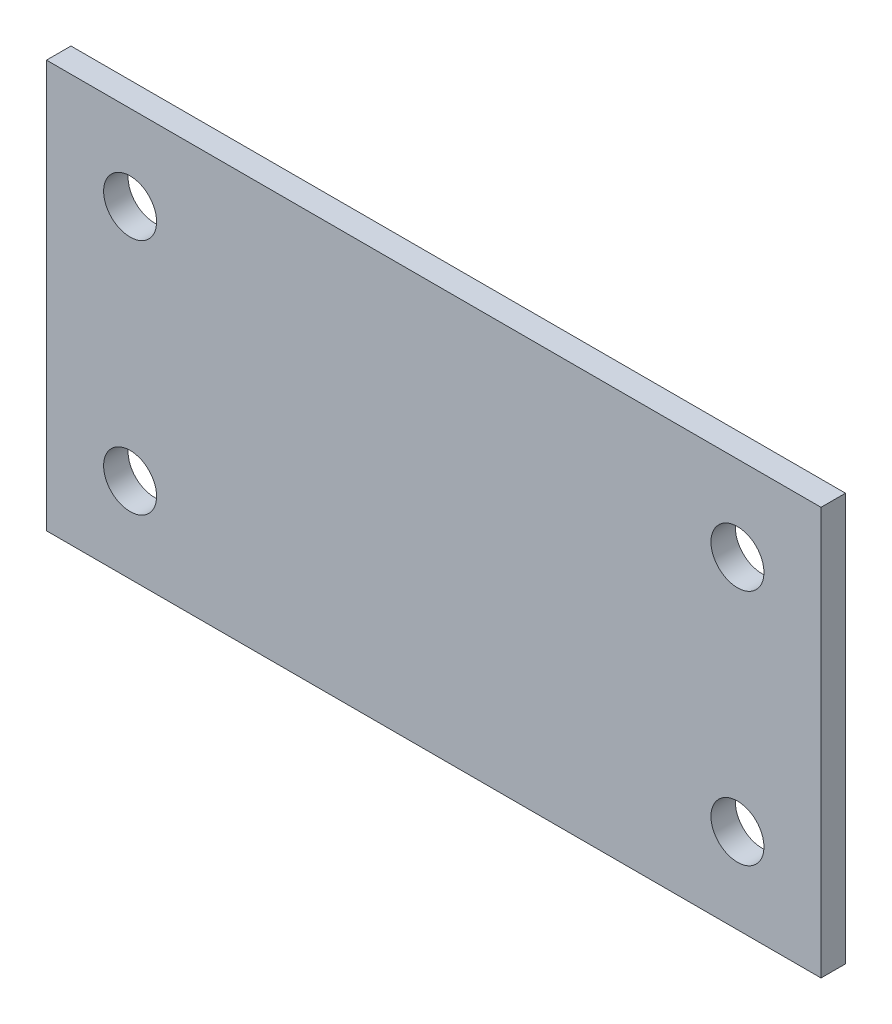
ISO-10303-21;
HEADER;
FILE_DESCRIPTION(('STEP AP214'),'2;1');
FILE_NAME('part.step','',(''),(''),'','','');
FILE_SCHEMA(('AUTOMOTIVE_DESIGN { 1 0 10303 214 1 1 1 1 }'));
ENDSEC;
DATA;
#1=APPLICATION_CONTEXT('core data for automotive mechanical design processes');
#2=APPLICATION_PROTOCOL_DEFINITION('international standard','automotive_design',2000,#1);
#3=PRODUCT_CONTEXT('',#1,'mechanical');
#4=PRODUCT('Part','Part','',(#3));
#5=PRODUCT_RELATED_PRODUCT_CATEGORY('part','',(#4));
#6=PRODUCT_DEFINITION_FORMATION('','',#4);
#7=PRODUCT_DEFINITION_CONTEXT('part definition',#1,'design');
#8=PRODUCT_DEFINITION('design','',#6,#7);
#9=PRODUCT_DEFINITION_SHAPE('','',#8);
#10=(LENGTH_UNIT() NAMED_UNIT(*) SI_UNIT(.MILLI.,.METRE.));
#11=(NAMED_UNIT(*) PLANE_ANGLE_UNIT() SI_UNIT($,.RADIAN.));
#12=(NAMED_UNIT(*) SI_UNIT($,.STERADIAN.) SOLID_ANGLE_UNIT());
#13=UNCERTAINTY_MEASURE_WITH_UNIT(LENGTH_MEASURE(1.E-05),#10,'distance_accuracy_value','');
#14=(GEOMETRIC_REPRESENTATION_CONTEXT(3) GLOBAL_UNCERTAINTY_ASSIGNED_CONTEXT((#13)) GLOBAL_UNIT_ASSIGNED_CONTEXT((#10,
#11,#12)) REPRESENTATION_CONTEXT('',''));
#15=CARTESIAN_POINT('',(0.,0.,0.));
#16=DIRECTION('',(0.,0.,1.));
#17=DIRECTION('',(1.,0.,0.));
#18=AXIS2_PLACEMENT_3D('',#15,#16,#17);
#19=CARTESIAN_POINT('',(0.,0.,12.));
#20=DIRECTION('',(0.,0.,-1.));
#21=DIRECTION('',(-1.,0.,0.));
#22=AXIS2_PLACEMENT_3D('',#19,#20,#21);
#23=PLANE('',#22);
#24=CARTESIAN_POINT('',(338.995198873229,158.313212162657,12.));
#25=DIRECTION('',(0.,0.,1.));
#26=DIRECTION('',(-1.,0.,0.));
#27=AXIS2_PLACEMENT_3D('',#24,#25,#26);
#28=CIRCLE('',#27,13.);
#29=CARTESIAN_POINT('',(325.995198873229,158.313212162657,12.));
#30=VERTEX_POINT('',#29);
#31=EDGE_CURVE('E131',#30,#30,#28,.T.);
#32=ORIENTED_EDGE('',*,*,#31,.F.);
#33=EDGE_LOOP('',(#32));
#34=FACE_BOUND('',#33,.T.);
#35=CARTESIAN_POINT('',(41.0048011267713,158.313212162657,12.));
#36=DIRECTION('',(0.,0.,-1.));
#37=DIRECTION('',(1.,0.,0.));
#38=AXIS2_PLACEMENT_3D('',#35,#36,#37);
#39=CIRCLE('',#38,13.);
#40=CARTESIAN_POINT('',(54.0048011267713,158.313212162657,12.));
#41=VERTEX_POINT('',#40);
#42=EDGE_CURVE('E119',#41,#41,#39,.T.);
#43=ORIENTED_EDGE('',*,*,#42,.T.);
#44=EDGE_LOOP('',(#43));
#45=FACE_BOUND('',#44,.T.);
#46=CARTESIAN_POINT('',(41.0048011267713,41.6867878373433,12.));
#47=DIRECTION('',(0.,0.,1.));
#48=DIRECTION('',(1.,0.,0.));
#49=AXIS2_PLACEMENT_3D('',#46,#47,#48);
#50=CIRCLE('',#49,13.);
#51=CARTESIAN_POINT('',(54.0048011267713,41.6867878373433,12.));
#52=VERTEX_POINT('',#51);
#53=EDGE_CURVE('E113',#52,#52,#50,.T.);
#54=ORIENTED_EDGE('',*,*,#53,.F.);
#55=EDGE_LOOP('',(#54));
#56=FACE_BOUND('',#55,.T.);
#57=DIRECTION('',(0.,-1.,0.));
#58=VECTOR('',#57,1.);
#59=CARTESIAN_POINT('',(0.,0.,12.));
#60=LINE('',#59,#58);
#61=CARTESIAN_POINT('',(0.,200.,12.));
#62=VERTEX_POINT('',#61);
#63=CARTESIAN_POINT('',(0.,0.,12.));
#64=VERTEX_POINT('',#63);
#65=EDGE_CURVE('E86',#62,#64,#60,.T.);
#66=ORIENTED_EDGE('',*,*,#65,.T.);
#67=DIRECTION('',(1.,0.,0.));
#68=VECTOR('',#67,1.);
#69=CARTESIAN_POINT('',(0.,0.,12.));
#70=LINE('',#69,#68);
#71=CARTESIAN_POINT('',(380.,0.,12.));
#72=VERTEX_POINT('',#71);
#73=EDGE_CURVE('E81',#64,#72,#70,.T.);
#74=ORIENTED_EDGE('',*,*,#73,.T.);
#75=DIRECTION('',(0.,1.,0.));
#76=VECTOR('',#75,1.);
#77=CARTESIAN_POINT('',(380.,0.,12.));
#78=LINE('',#77,#76);
#79=CARTESIAN_POINT('',(380.,200.,12.));
#80=VERTEX_POINT('',#79);
#81=EDGE_CURVE('E84',#72,#80,#78,.T.);
#82=ORIENTED_EDGE('',*,*,#81,.T.);
#83=DIRECTION('',(-1.,0.,0.));
#84=VECTOR('',#83,1.);
#85=CARTESIAN_POINT('',(0.,200.,12.));
#86=LINE('',#85,#84);
#87=EDGE_CURVE('E51',#80,#62,#86,.T.);
#88=ORIENTED_EDGE('',*,*,#87,.T.);
#89=EDGE_LOOP('',(#66,#74,#82,#88));
#90=FACE_BOUND('',#89,.T.);
#91=CARTESIAN_POINT('',(338.995198873229,41.6867878373433,12.));
#92=DIRECTION('',(0.,0.,-1.));
#93=DIRECTION('',(-1.,0.,0.));
#94=AXIS2_PLACEMENT_3D('',#91,#92,#93);
#95=CIRCLE('',#94,13.);
#96=CARTESIAN_POINT('',(325.995198873229,41.6867878373433,12.));
#97=VERTEX_POINT('',#96);
#98=EDGE_CURVE('E125',#97,#97,#95,.T.);
#99=ORIENTED_EDGE('',*,*,#98,.T.);
#100=EDGE_LOOP('',(#99));
#101=FACE_BOUND('',#100,.T.);
#102=ADVANCED_FACE('F34',(#34,#45,#56,#90,#101),#23,.F.);
#103=CARTESIAN_POINT('',(0.,0.,0.));
#104=DIRECTION('',(0.,0.,-1.));
#105=DIRECTION('',(-1.,0.,0.));
#106=AXIS2_PLACEMENT_3D('',#103,#104,#105);
#107=PLANE('',#106);
#108=CARTESIAN_POINT('',(338.995198873229,158.313212162657,0.));
#109=DIRECTION('',(0.,0.,1.));
#110=DIRECTION('',(-1.,0.,0.));
#111=AXIS2_PLACEMENT_3D('',#108,#109,#110);
#112=CIRCLE('',#111,13.);
#113=CARTESIAN_POINT('',(325.995198873229,158.313212162657,0.));
#114=VERTEX_POINT('',#113);
#115=EDGE_CURVE('E128',#114,#114,#112,.T.);
#116=ORIENTED_EDGE('',*,*,#115,.T.);
#117=EDGE_LOOP('',(#116));
#118=FACE_BOUND('',#117,.T.);
#119=CARTESIAN_POINT('',(41.0048011267713,158.313212162657,0.));
#120=DIRECTION('',(0.,0.,-1.));
#121=DIRECTION('',(1.,0.,0.));
#122=AXIS2_PLACEMENT_3D('',#119,#120,#121);
#123=CIRCLE('',#122,13.);
#124=CARTESIAN_POINT('',(54.0048011267713,158.313212162657,0.));
#125=VERTEX_POINT('',#124);
#126=EDGE_CURVE('E116',#125,#125,#123,.T.);
#127=ORIENTED_EDGE('',*,*,#126,.F.);
#128=EDGE_LOOP('',(#127));
#129=FACE_BOUND('',#128,.T.);
#130=CARTESIAN_POINT('',(41.0048011267713,41.6867878373433,0.));
#131=DIRECTION('',(0.,0.,1.));
#132=DIRECTION('',(1.,0.,0.));
#133=AXIS2_PLACEMENT_3D('',#130,#131,#132);
#134=CIRCLE('',#133,13.);
#135=CARTESIAN_POINT('',(54.0048011267713,41.6867878373433,0.));
#136=VERTEX_POINT('',#135);
#137=EDGE_CURVE('E101',#136,#136,#134,.T.);
#138=ORIENTED_EDGE('',*,*,#137,.T.);
#139=EDGE_LOOP('',(#138));
#140=FACE_BOUND('',#139,.T.);
#141=DIRECTION('',(0.,-1.,0.));
#142=VECTOR('',#141,1.);
#143=CARTESIAN_POINT('',(0.,0.,0.));
#144=LINE('',#143,#142);
#145=CARTESIAN_POINT('',(0.,200.,0.));
#146=VERTEX_POINT('',#145);
#147=CARTESIAN_POINT('',(0.,0.,0.));
#148=VERTEX_POINT('',#147);
#149=EDGE_CURVE('E98',#146,#148,#144,.T.);
#150=ORIENTED_EDGE('',*,*,#149,.F.);
#151=DIRECTION('',(-1.,0.,0.));
#152=VECTOR('',#151,1.);
#153=CARTESIAN_POINT('',(0.,200.,0.));
#154=LINE('',#153,#152);
#155=CARTESIAN_POINT('',(380.,200.,0.));
#156=VERTEX_POINT('',#155);
#157=EDGE_CURVE('E74',#156,#146,#154,.T.);
#158=ORIENTED_EDGE('',*,*,#157,.F.);
#159=DIRECTION('',(0.,1.,0.));
#160=VECTOR('',#159,1.);
#161=CARTESIAN_POINT('',(380.,0.,0.));
#162=LINE('',#161,#160);
#163=CARTESIAN_POINT('',(380.,0.,0.));
#164=VERTEX_POINT('',#163);
#165=EDGE_CURVE('E68',#164,#156,#162,.T.);
#166=ORIENTED_EDGE('',*,*,#165,.F.);
#167=DIRECTION('',(1.,0.,0.));
#168=VECTOR('',#167,1.);
#169=CARTESIAN_POINT('',(0.,0.,0.));
#170=LINE('',#169,#168);
#171=EDGE_CURVE('E90',#148,#164,#170,.T.);
#172=ORIENTED_EDGE('',*,*,#171,.F.);
#173=EDGE_LOOP('',(#150,#158,#166,#172));
#174=FACE_BOUND('',#173,.T.);
#175=CARTESIAN_POINT('',(338.995198873229,41.6867878373433,0.));
#176=DIRECTION('',(0.,0.,-1.));
#177=DIRECTION('',(-1.,0.,0.));
#178=AXIS2_PLACEMENT_3D('',#175,#176,#177);
#179=CIRCLE('',#178,13.);
#180=CARTESIAN_POINT('',(325.995198873229,41.6867878373433,0.));
#181=VERTEX_POINT('',#180);
#182=EDGE_CURVE('E122',#181,#181,#179,.T.);
#183=ORIENTED_EDGE('',*,*,#182,.F.);
#184=EDGE_LOOP('',(#183));
#185=FACE_BOUND('',#184,.T.);
#186=ADVANCED_FACE('F109',(#118,#129,#140,#174,#185),#107,.T.);
#187=CARTESIAN_POINT('',(0.,0.,12.));
#188=DIRECTION('',(1.,0.,0.));
#189=DIRECTION('',(0.,0.,-1.));
#190=AXIS2_PLACEMENT_3D('',#187,#188,#189);
#191=PLANE('',#190);
#192=ORIENTED_EDGE('',*,*,#149,.T.);
#193=DIRECTION('',(0.,0.,-1.));
#194=VECTOR('',#193,1.);
#195=CARTESIAN_POINT('',(0.,0.,12.));
#196=LINE('',#195,#194);
#197=EDGE_CURVE('E11',#64,#148,#196,.T.);
#198=ORIENTED_EDGE('',*,*,#197,.F.);
#199=ORIENTED_EDGE('',*,*,#65,.F.);
#200=DIRECTION('',(0.,0.,-1.));
#201=VECTOR('',#200,1.);
#202=CARTESIAN_POINT('',(0.,200.,12.));
#203=LINE('',#202,#201);
#204=EDGE_CURVE('E94',#62,#146,#203,.T.);
#205=ORIENTED_EDGE('',*,*,#204,.T.);
#206=EDGE_LOOP('',(#192,#198,#199,#205));
#207=FACE_BOUND('',#206,.T.);
#208=ADVANCED_FACE('F36',(#207),#191,.F.);
#209=CARTESIAN_POINT('',(0.,0.,12.));
#210=DIRECTION('',(0.,1.,0.));
#211=DIRECTION('',(0.,0.,1.));
#212=AXIS2_PLACEMENT_3D('',#209,#210,#211);
#213=PLANE('',#212);
#214=ORIENTED_EDGE('',*,*,#171,.T.);
#215=DIRECTION('',(0.,0.,-1.));
#216=VECTOR('',#215,1.);
#217=CARTESIAN_POINT('',(380.,0.,12.));
#218=LINE('',#217,#216);
#219=EDGE_CURVE('E43',#72,#164,#218,.T.);
#220=ORIENTED_EDGE('',*,*,#219,.F.);
#221=ORIENTED_EDGE('',*,*,#73,.F.);
#222=ORIENTED_EDGE('',*,*,#197,.T.);
#223=EDGE_LOOP('',(#214,#220,#221,#222));
#224=FACE_BOUND('',#223,.T.);
#225=ADVANCED_FACE('F89',(#224),#213,.F.);
#226=CARTESIAN_POINT('',(380.,0.,12.));
#227=DIRECTION('',(-1.,0.,0.));
#228=DIRECTION('',(0.,0.,1.));
#229=AXIS2_PLACEMENT_3D('',#226,#227,#228);
#230=PLANE('',#229);
#231=ORIENTED_EDGE('',*,*,#165,.T.);
#232=DIRECTION('',(0.,0.,-1.));
#233=VECTOR('',#232,1.);
#234=CARTESIAN_POINT('',(380.,200.,12.));
#235=LINE('',#234,#233);
#236=EDGE_CURVE('E91',#80,#156,#235,.T.);
#237=ORIENTED_EDGE('',*,*,#236,.F.);
#238=ORIENTED_EDGE('',*,*,#81,.F.);
#239=ORIENTED_EDGE('',*,*,#219,.T.);
#240=EDGE_LOOP('',(#231,#237,#238,#239));
#241=FACE_BOUND('',#240,.T.);
#242=ADVANCED_FACE('F92',(#241),#230,.F.);
#243=CARTESIAN_POINT('',(0.,200.,12.));
#244=DIRECTION('',(0.,-1.,0.));
#245=DIRECTION('',(0.,0.,-1.));
#246=AXIS2_PLACEMENT_3D('',#243,#244,#245);
#247=PLANE('',#246);
#248=ORIENTED_EDGE('',*,*,#157,.T.);
#249=ORIENTED_EDGE('',*,*,#204,.F.);
#250=ORIENTED_EDGE('',*,*,#87,.F.);
#251=ORIENTED_EDGE('',*,*,#236,.T.);
#252=EDGE_LOOP('',(#248,#249,#250,#251));
#253=FACE_BOUND('',#252,.T.);
#254=ADVANCED_FACE('F106',(#253),#247,.F.);
#255=CARTESIAN_POINT('',(41.0048011267713,41.6867878373433,0.));
#256=DIRECTION('',(0.,0.,1.));
#257=DIRECTION('',(1.,0.,0.));
#258=AXIS2_PLACEMENT_3D('',#255,#256,#257);
#259=CYLINDRICAL_SURFACE('',#258,13.);
#260=ORIENTED_EDGE('',*,*,#137,.F.);
#261=EDGE_LOOP('',(#260));
#262=FACE_BOUND('',#261,.T.);
#263=ORIENTED_EDGE('',*,*,#53,.T.);
#264=EDGE_LOOP('',(#263));
#265=FACE_BOUND('',#264,.T.);
#266=ADVANCED_FACE('F153',(#262,#265),#259,.F.);
#267=CARTESIAN_POINT('',(41.0048011267713,158.313212162657,0.));
#268=DIRECTION('',(0.,0.,1.));
#269=DIRECTION('',(1.,0.,0.));
#270=AXIS2_PLACEMENT_3D('',#267,#268,#269);
#271=CYLINDRICAL_SURFACE('',#270,13.);
#272=ORIENTED_EDGE('',*,*,#126,.T.);
#273=EDGE_LOOP('',(#272));
#274=FACE_BOUND('',#273,.T.);
#275=ORIENTED_EDGE('',*,*,#42,.F.);
#276=EDGE_LOOP('',(#275));
#277=FACE_BOUND('',#276,.T.);
#278=ADVANCED_FACE('F155',(#274,#277),#271,.F.);
#279=CARTESIAN_POINT('',(338.995198873229,41.6867878373433,0.));
#280=DIRECTION('',(0.,0.,1.));
#281=DIRECTION('',(1.,0.,0.));
#282=AXIS2_PLACEMENT_3D('',#279,#280,#281);
#283=CYLINDRICAL_SURFACE('',#282,13.);
#284=ORIENTED_EDGE('',*,*,#182,.T.);
#285=EDGE_LOOP('',(#284));
#286=FACE_BOUND('',#285,.T.);
#287=ORIENTED_EDGE('',*,*,#98,.F.);
#288=EDGE_LOOP('',(#287));
#289=FACE_BOUND('',#288,.T.);
#290=ADVANCED_FACE('F142',(#286,#289),#283,.F.);
#291=CARTESIAN_POINT('',(338.995198873229,158.313212162657,0.));
#292=DIRECTION('',(0.,0.,1.));
#293=DIRECTION('',(1.,0.,0.));
#294=AXIS2_PLACEMENT_3D('',#291,#292,#293);
#295=CYLINDRICAL_SURFACE('',#294,13.);
#296=ORIENTED_EDGE('',*,*,#115,.F.);
#297=EDGE_LOOP('',(#296));
#298=FACE_BOUND('',#297,.T.);
#299=ORIENTED_EDGE('',*,*,#31,.T.);
#300=EDGE_LOOP('',(#299));
#301=FACE_BOUND('',#300,.T.);
#302=ADVANCED_FACE('F139',(#298,#301),#295,.F.);
#303=CLOSED_SHELL('',(#102,#186,#208,#225,#242,#254,#266,#278,#290,#302));
#304=MANIFOLD_SOLID_BREP('B2',#303);
#305=ADVANCED_BREP_SHAPE_REPRESENTATION('',(#18,#304),#14);
#306=SHAPE_DEFINITION_REPRESENTATION(#9,#305);
ENDSEC;
END-ISO-10303-21;
